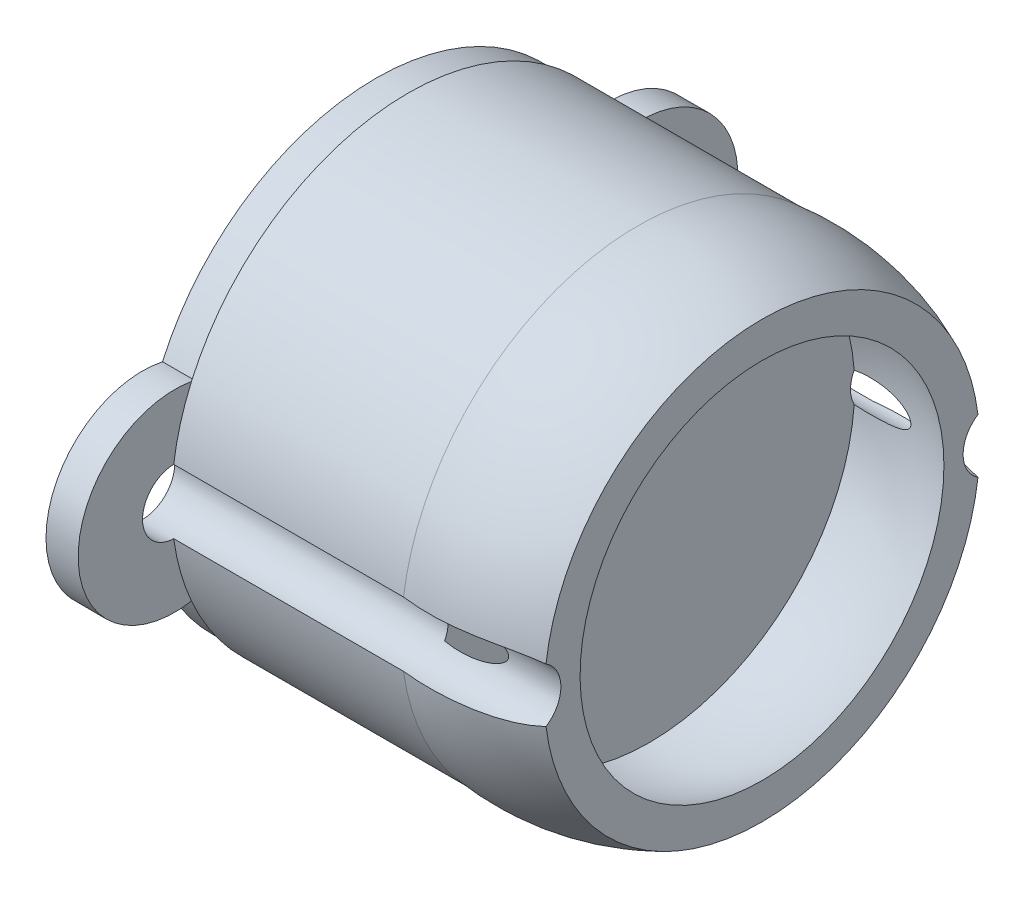
ISO-10303-21;
HEADER;
FILE_DESCRIPTION(('STEP AP214'),'2;1');
FILE_NAME('part.step','',(''),(''),'','','');
FILE_SCHEMA(('AUTOMOTIVE_DESIGN { 1 0 10303 214 1 1 1 1 }'));
ENDSEC;
DATA;
#1=APPLICATION_CONTEXT('core data for automotive mechanical design processes');
#2=APPLICATION_PROTOCOL_DEFINITION('international standard','automotive_design',2000,#1);
#3=PRODUCT_CONTEXT('',#1,'mechanical');
#4=PRODUCT('Part','Part','',(#3));
#5=PRODUCT_RELATED_PRODUCT_CATEGORY('part','',(#4));
#6=PRODUCT_DEFINITION_FORMATION('','',#4);
#7=PRODUCT_DEFINITION_CONTEXT('part definition',#1,'design');
#8=PRODUCT_DEFINITION('design','',#6,#7);
#9=PRODUCT_DEFINITION_SHAPE('','',#8);
#10=(LENGTH_UNIT() NAMED_UNIT(*) SI_UNIT(.MILLI.,.METRE.));
#11=(NAMED_UNIT(*) PLANE_ANGLE_UNIT() SI_UNIT($,.RADIAN.));
#12=(NAMED_UNIT(*) SI_UNIT($,.STERADIAN.) SOLID_ANGLE_UNIT());
#13=UNCERTAINTY_MEASURE_WITH_UNIT(LENGTH_MEASURE(1.E-05),#10,'distance_accuracy_value','');
#14=(GEOMETRIC_REPRESENTATION_CONTEXT(3) GLOBAL_UNCERTAINTY_ASSIGNED_CONTEXT((#13)) GLOBAL_UNIT_ASSIGNED_CONTEXT((#10,
#11,#12)) REPRESENTATION_CONTEXT('',''));
#15=CARTESIAN_POINT('',(0.,0.,0.));
#16=DIRECTION('',(0.,0.,1.));
#17=DIRECTION('',(1.,0.,0.));
#18=AXIS2_PLACEMENT_3D('',#15,#16,#17);
#19=CARTESIAN_POINT('',(0.,0.,0.));
#20=DIRECTION('',(-1.,0.,0.));
#21=DIRECTION('',(0.,1.,0.));
#22=AXIS2_PLACEMENT_3D('',#19,#20,#21);
#23=SPHERICAL_SURFACE('',#22,7.4);
#24=CARTESIAN_POINT('',(3.,0.,0.));
#25=DIRECTION('',(1.,0.,0.));
#26=DIRECTION('',(0.,0.,-1.));
#27=AXIS2_PLACEMENT_3D('',#24,#25,#26);
#28=CIRCLE('',#27,6.76461381011511);
#29=CARTESIAN_POINT('',(3.,0.842878804427795,-6.71189655172414));
#30=VERTEX_POINT('',#29);
#31=CARTESIAN_POINT('',(3.,0.842878804427795,6.71189655172414));
#32=VERTEX_POINT('',#31);
#33=EDGE_CURVE('E163',#30,#32,#28,.T.);
#34=ORIENTED_EDGE('',*,*,#33,.F.);
#35=CARTESIAN_POINT('',(3.0002,0.842825962899222,-6.71181379034483));
#36=CARTESIAN_POINT('',(2.94052392284516,0.85856987616232,-6.73651264605973));
#37=CARTESIAN_POINT('',(2.88021192087948,0.872535783706459,-6.76073072167284));
#38=CARTESIAN_POINT('',(2.75857016443362,0.897435475728505,-6.80803261158258));
#39=CARTESIAN_POINT('',(2.69724111722747,0.908371280811858,-6.83111717326338));
#40=CARTESIAN_POINT('',(2.57390460429067,0.927728292467096,-6.87595257796477));
#41=CARTESIAN_POINT('',(2.51189939879008,0.936156163466943,-6.89770683144518));
#42=CARTESIAN_POINT('',(2.38717399417968,0.950949009020406,-6.93984764776638));
#43=CARTESIAN_POINT('',(2.32445366355035,0.957313597565562,-6.96023395412018));
#44=CARTESIAN_POINT('',(2.13734573728468,0.973691091688867,-7.01859585462346));
#45=CARTESIAN_POINT('',(2.01208494708901,0.98126450266526,-7.05447702100492));
#46=CARTESIAN_POINT('',(1.75969596793601,0.992088194149682,-7.12013224646779));
#47=CARTESIAN_POINT('',(1.63256617814521,0.995334520501119,-7.14990069867588));
#48=CARTESIAN_POINT('',(1.40890128498073,0.998756434348531,-7.19632327820146));
#49=CARTESIAN_POINT('',(1.31266569913933,0.999496924264198,-7.21439531998566));
#50=CARTESIAN_POINT('',(1.11955541337494,1.00012634603968,-7.24678745454948));
#51=CARTESIAN_POINT('',(1.02268067619043,1.00001522780588,-7.26110732656633));
#52=CARTESIAN_POINT('',(0.8284549642304,0.999432205293791,-7.28590290932634));
#53=CARTESIAN_POINT('',(0.731104055197729,0.998960349497552,-7.29637913636393));
#54=CARTESIAN_POINT('',(0.536060782720088,0.998023189220245,-7.31342408006376));
#55=CARTESIAN_POINT('',(0.43836842143589,0.997557884697813,-7.31999282140839));
#56=CARTESIAN_POINT('',(0.240579429502072,0.996863433113591,-7.32928423720738));
#57=CARTESIAN_POINT('',(0.140478503394669,0.996639879179858,-7.33191634054659));
#58=CARTESIAN_POINT('',(-0.0597489378480785,0.996546580765673,-7.33303134087526));
#59=CARTESIAN_POINT('',(-0.159875453516562,0.996676844381574,-7.33151414291688));
#60=CARTESIAN_POINT('',(-0.36003126524138,0.997241477962107,-7.32433747782041));
#61=CARTESIAN_POINT('',(-0.46006048223718,0.997676008181235,-7.31867582776509));
#62=CARTESIAN_POINT('',(-0.659799728251885,0.998603920638728,-7.30325221044215));
#63=CARTESIAN_POINT('',(-0.759509765250003,0.999097301393896,-7.29349034649564));
#64=CARTESIAN_POINT('',(-0.858978201865889,0.999497414605628,-7.28170044473926));
#65=B_SPLINE_CURVE_WITH_KNOTS('',3,(#35,#36,#37,#38,#39,#40,#41,#42,#43,#44,#45,#46,#47,#48,#49,
#50,#51,#52,#53,#54,#55,#56,#57,#58,#59,#60,#61,#62,#63,#64),.UNSPECIFIED.,.F.,.F.,(4,2,2,2,2,2,
2,2,2,2,2,2,2,2,4),(0.,0.199359639390929,0.398586015302419,0.597278152275551,0.796007440072744,
1.18727368016281,1.57889722080513,1.8725842723743,2.16628859944464,2.45995346046835,
2.75361646648065,3.05393716098586,3.35426472774209,3.65475059343574,3.95522888765317),.UNSPECIFIED.);
#66=CARTESIAN_POINT('',(-0.858778201865886,0.999496662862131,-7.28172413793103));
#67=VERTEX_POINT('',#66);
#68=EDGE_CURVE('E141',#30,#67,#65,.T.);
#69=ORIENTED_EDGE('',*,*,#68,.T.);
#70=CARTESIAN_POINT('',(-0.858778201865886,0.,0.));
#71=DIRECTION('',(1.,0.,0.));
#72=DIRECTION('',(0.,0.,-1.));
#73=AXIS2_PLACEMENT_3D('',#70,#71,#72);
#74=CIRCLE('',#73,7.35);
#75=CARTESIAN_POINT('',(-0.858778201865886,0.99949666286213,7.28172413793103));
#76=VERTEX_POINT('',#75);
#77=EDGE_CURVE('E49',#76,#67,#74,.F.);
#78=ORIENTED_EDGE('',*,*,#77,.F.);
#79=CARTESIAN_POINT('',(-0.85897820186589,0.999497414605628,7.28170044473926));
#80=CARTESIAN_POINT('',(-0.774344868476737,0.999166023312695,7.29173021962759));
#81=CARTESIAN_POINT('',(-0.689537675667096,0.998756143069292,7.30029380749209));
#82=CARTESIAN_POINT('',(-0.519674613829083,0.997949143013654,7.31445811244261));
#83=CARTESIAN_POINT('',(-0.434618739933436,0.997552023453025,7.32005877114145));
#84=CARTESIAN_POINT('',(-0.264406065076853,0.996940472518664,7.32826413653552));
#85=CARTESIAN_POINT('',(-0.179249342049621,0.996725943907646,7.33087043810973));
#86=CARTESIAN_POINT('',(-0.00890137042662052,0.99654268835869,7.33308126242885));
#87=CARTESIAN_POINT('',(0.076289877734785,0.99657395841881,7.33268582183408));
#88=CARTESIAN_POINT('',(0.328612284238158,0.997040041085887,7.32706434616021));
#89=CARTESIAN_POINT('',(0.495667100788743,0.997834385811191,7.31755412166948));
#90=CARTESIAN_POINT('',(0.828774125578414,0.999424014195547,7.28713054894258));
#91=CARTESIAN_POINT('',(0.994825982319595,1.00021929807885,7.26621341368135));
#92=CARTESIAN_POINT('',(1.31724352695357,0.999689411087638,7.21462784814186));
#93=CARTESIAN_POINT('',(1.47369208563147,0.998464019990784,7.18447469693398));
#94=CARTESIAN_POINT('',(1.7842635639575,0.991426545173003,7.11468823519463));
#95=CARTESIAN_POINT('',(1.93838832220338,0.985618305021037,7.07506288825923));
#96=CARTESIAN_POINT('',(2.16872532545103,0.970702907982303,7.00863355486231));
#97=CARTESIAN_POINT('',(2.24607868697433,0.964610546030119,6.98507205052215));
#98=CARTESIAN_POINT('',(2.39982176234039,0.949710111793187,6.93581101986002));
#99=CARTESIAN_POINT('',(2.47621173805002,0.940902794802046,6.9101120896146));
#100=CARTESIAN_POINT('',(2.6280768735203,0.919841443121517,6.85665473151799));
#101=CARTESIAN_POINT('',(2.7035484273195,0.907576720608523,6.82889011711303));
#102=CARTESIAN_POINT('',(2.81566675384788,0.885941159615761,6.78592555227531));
#103=CARTESIAN_POINT('',(2.85287711853164,0.878184676420503,6.77137650460669));
#104=CARTESIAN_POINT('',(2.92687320171281,0.861453364498084,6.74188164152994));
#105=CARTESIAN_POINT('',(2.96365882571267,0.852478270109468,6.72693574017946));
#106=CARTESIAN_POINT('',(3.0002,0.842825962899222,6.71181379034483));
#107=B_SPLINE_CURVE_WITH_KNOTS('',3,(#79,#80,#81,#82,#83,#84,#85,#86,#87,#88,#89,#90,#91,#92,
#93,#94,#95,#96,#97,#98,#99,#100,#101,#102,#103,#104,#105,#106),.UNSPECIFIED.,.F.,.F.,(4,2,2,2,
2,2,2,2,2,2,2,2,2,4),(0.,0.255666299548316,0.511337637042939,0.766872733555695,1.0224047092203,
1.52395408463691,2.02567007285728,2.5033453484021,2.98062042991518,3.22383079476211,
3.46697356007113,3.71087635009909,3.83295493443389,3.95506017518141),.UNSPECIFIED.);
#108=EDGE_CURVE('E170',#76,#32,#107,.T.);
#109=ORIENTED_EDGE('',*,*,#108,.T.);
#110=EDGE_LOOP('',(#34,#69,#78,#109));
#111=FACE_BOUND('',#110,.T.);
#112=ADVANCED_FACE('F39',(#111),#23,.T.);
#113=CARTESIAN_POINT('',(-0.5,0.,0.));
#114=DIRECTION('',(-1.,0.,0.));
#115=DIRECTION('',(0.,0.,1.));
#116=AXIS2_PLACEMENT_3D('',#113,#114,#115);
#117=CYLINDRICAL_SURFACE('',#116,7.35);
#118=CARTESIAN_POINT('',(-8.,0.,0.));
#119=DIRECTION('',(-1.,0.,0.));
#120=DIRECTION('',(0.,0.,1.));
#121=AXIS2_PLACEMENT_3D('',#118,#119,#120);
#122=CIRCLE('',#121,7.35);
#123=CARTESIAN_POINT('',(-8.,-0.999496662862128,-7.28172413793104));
#124=VERTEX_POINT('',#123);
#125=CARTESIAN_POINT('',(-8.,-2.9545896500191,-6.73));
#126=VERTEX_POINT('',#125);
#127=EDGE_CURVE('E280',#124,#126,#122,.T.);
#128=ORIENTED_EDGE('',*,*,#127,.F.);
#129=DIRECTION('',(-1.,0.,0.));
#130=VECTOR('',#129,1.);
#131=CARTESIAN_POINT('',(-3.,-0.999496662862128,-7.28172413793104));
#132=LINE('',#131,#130);
#133=CARTESIAN_POINT('',(-0.858778201865886,-0.999496662862126,-7.28172413793103));
#134=VERTEX_POINT('',#133);
#135=EDGE_CURVE('E265',#124,#134,#132,.F.);
#136=ORIENTED_EDGE('',*,*,#135,.T.);
#137=CARTESIAN_POINT('',(-0.858778201865886,-0.999496662862129,7.28172413793103));
#138=VERTEX_POINT('',#137);
#139=EDGE_CURVE('E11',#134,#138,#74,.F.);
#140=ORIENTED_EDGE('',*,*,#139,.T.);
#141=DIRECTION('',(-1.,0.,0.));
#142=VECTOR('',#141,1.);
#143=CARTESIAN_POINT('',(-3.,-0.99949666286213,7.28172413793103));
#144=LINE('',#143,#142);
#145=CARTESIAN_POINT('',(-8.,-0.99949666286213,7.28172413793103));
#146=VERTEX_POINT('',#145);
#147=EDGE_CURVE('E202',#138,#146,#144,.T.);
#148=ORIENTED_EDGE('',*,*,#147,.T.);
#149=CARTESIAN_POINT('',(-8.,0.,0.));
#150=DIRECTION('',(-1.,0.,0.));
#151=DIRECTION('',(0.,0.,1.));
#152=AXIS2_PLACEMENT_3D('',#149,#150,#151);
#153=CIRCLE('',#152,7.35);
#154=CARTESIAN_POINT('',(-8.,-2.9545896500191,6.73));
#155=VERTEX_POINT('',#154);
#156=EDGE_CURVE('E320',#155,#146,#153,.T.);
#157=ORIENTED_EDGE('',*,*,#156,.F.);
#158=CARTESIAN_POINT('',(-8.,0.,0.));
#159=DIRECTION('',(1.,0.,0.));
#160=DIRECTION('',(0.,0.,-1.));
#161=AXIS2_PLACEMENT_3D('',#158,#159,#160);
#162=CIRCLE('',#161,7.35);
#163=EDGE_CURVE('E283',#155,#126,#162,.T.);
#164=ORIENTED_EDGE('',*,*,#163,.T.);
#165=EDGE_LOOP('',(#128,#136,#140,#148,#157,#164));
#166=FACE_BOUND('',#165,.T.);
#167=ADVANCED_FACE('F278',(#166),#117,.T.);
#168=CARTESIAN_POINT('',(-8.,0.,0.));
#169=DIRECTION('',(1.,0.,0.));
#170=DIRECTION('',(0.,0.,-1.));
#171=AXIS2_PLACEMENT_3D('',#168,#169,#170);
#172=PLANE('',#171);
#173=CARTESIAN_POINT('',(-8.,2.9545896500191,-6.73));
#174=VERTEX_POINT('',#173);
#175=CARTESIAN_POINT('',(-8.,2.9545896500191,6.73));
#176=VERTEX_POINT('',#175);
#177=EDGE_CURVE('E328',#174,#176,#162,.T.);
#178=ORIENTED_EDGE('',*,*,#177,.F.);
#179=CARTESIAN_POINT('',(-8.,0.,-7.25));
#180=DIRECTION('',(-1.,0.,0.));
#181=DIRECTION('',(0.,0.,1.));
#182=AXIS2_PLACEMENT_3D('',#179,#180,#181);
#183=CIRCLE('',#182,3.);
#184=CARTESIAN_POINT('',(-8.,2.93508847429885,-6.62931034482759));
#185=VERTEX_POINT('',#184);
#186=EDGE_CURVE('E346',#185,#174,#183,.T.);
#187=ORIENTED_EDGE('',*,*,#186,.F.);
#188=CARTESIAN_POINT('',(-8.,0.,0.));
#189=DIRECTION('',(1.,0.,0.));
#190=DIRECTION('',(0.,0.,-1.));
#191=AXIS2_PLACEMENT_3D('',#188,#189,#190);
#192=CIRCLE('',#191,7.25);
#193=CARTESIAN_POINT('',(-8.,2.93508847429885,6.62931034482759));
#194=VERTEX_POINT('',#193);
#195=EDGE_CURVE('E324',#185,#194,#192,.T.);
#196=ORIENTED_EDGE('',*,*,#195,.T.);
#197=CARTESIAN_POINT('',(-8.,0.,7.25));
#198=DIRECTION('',(-1.,0.,0.));
#199=DIRECTION('',(0.,0.,1.));
#200=AXIS2_PLACEMENT_3D('',#197,#198,#199);
#201=CIRCLE('',#200,3.);
#202=EDGE_CURVE('E304',#176,#194,#201,.T.);
#203=ORIENTED_EDGE('',*,*,#202,.F.);
#204=EDGE_LOOP('',(#178,#187,#196,#203));
#205=FACE_BOUND('',#204,.T.);
#206=ADVANCED_FACE('F344',(#205),#172,.F.);
#207=CARTESIAN_POINT('',(-9.,0.,0.));
#208=DIRECTION('',(1.,0.,0.));
#209=DIRECTION('',(0.,0.,-1.));
#210=AXIS2_PLACEMENT_3D('',#207,#208,#209);
#211=CYLINDRICAL_SURFACE('',#210,7.25);
#212=DIRECTION('',(-1.,0.,0.));
#213=VECTOR('',#212,1.);
#214=CARTESIAN_POINT('',(-8.5,2.93508847429885,-6.62931034482759));
#215=LINE('',#214,#213);
#216=CARTESIAN_POINT('',(-9.,2.93508847429885,-6.62931034482759));
#217=VERTEX_POINT('',#216);
#218=EDGE_CURVE('E288',#217,#185,#215,.F.);
#219=ORIENTED_EDGE('',*,*,#218,.F.);
#220=CARTESIAN_POINT('',(-9.,0.,0.));
#221=DIRECTION('',(1.,0.,0.));
#222=DIRECTION('',(0.,0.,-1.));
#223=AXIS2_PLACEMENT_3D('',#220,#221,#222);
#224=CIRCLE('',#223,7.25);
#225=CARTESIAN_POINT('',(-9.,2.93508847429885,6.62931034482759));
#226=VERTEX_POINT('',#225);
#227=EDGE_CURVE('E329',#217,#226,#224,.T.);
#228=ORIENTED_EDGE('',*,*,#227,.T.);
#229=DIRECTION('',(-1.,0.,0.));
#230=VECTOR('',#229,1.);
#231=CARTESIAN_POINT('',(-8.5,2.93508847429885,6.62931034482759));
#232=LINE('',#231,#230);
#233=EDGE_CURVE('E308',#194,#226,#232,.T.);
#234=ORIENTED_EDGE('',*,*,#233,.F.);
#235=ORIENTED_EDGE('',*,*,#195,.F.);
#236=EDGE_LOOP('',(#219,#228,#234,#235));
#237=FACE_BOUND('',#236,.T.);
#238=ADVANCED_FACE('F354',(#237),#211,.T.);
#239=ORIENTED_EDGE('',*,*,#139,.F.);
#240=CARTESIAN_POINT('',(-0.85897820186589,-0.999497414605626,-7.28170044473926));
#241=CARTESIAN_POINT('',(-0.774344868476737,-0.999166023312693,-7.29173021962759));
#242=CARTESIAN_POINT('',(-0.689537675667096,-0.998756143069291,-7.30029380749209));
#243=CARTESIAN_POINT('',(-0.519674613829083,-0.997949143013653,-7.31445811244261));
#244=CARTESIAN_POINT('',(-0.434618739933436,-0.997552023453023,-7.32005877114145));
#245=CARTESIAN_POINT('',(-0.264406065076853,-0.996940472518662,-7.32826413653552));
#246=CARTESIAN_POINT('',(-0.179249342049621,-0.996725943907644,-7.33087043810973));
#247=CARTESIAN_POINT('',(-0.00890137042662122,-0.996542688358688,-7.33308126242885));
#248=CARTESIAN_POINT('',(0.0762898777347842,-0.996573958418809,-7.33268582183408));
#249=CARTESIAN_POINT('',(0.328612284238157,-0.997040041085885,-7.32706434616021));
#250=CARTESIAN_POINT('',(0.495667100788742,-0.997834385811189,-7.31755412166949));
#251=CARTESIAN_POINT('',(0.828774125578413,-0.999424014195545,-7.28713054894258));
#252=CARTESIAN_POINT('',(0.994825982319593,-1.00021929807885,-7.26621341368135));
#253=CARTESIAN_POINT('',(1.31724352695357,-0.999689411087636,-7.21462784814186));
#254=CARTESIAN_POINT('',(1.47369208563147,-0.998464019990783,-7.18447469693398));
#255=CARTESIAN_POINT('',(1.7842635639575,-0.991426545173001,-7.11468823519463));
#256=CARTESIAN_POINT('',(1.93838832220338,-0.985618305021036,-7.07506288825923));
#257=CARTESIAN_POINT('',(2.16872532545103,-0.970702907982302,-7.00863355486231));
#258=CARTESIAN_POINT('',(2.24607868697433,-0.964610546030117,-6.98507205052215));
#259=CARTESIAN_POINT('',(2.39982176234039,-0.949710111793185,-6.93581101986002));
#260=CARTESIAN_POINT('',(2.47621173805002,-0.940902794802044,-6.9101120896146));
#261=CARTESIAN_POINT('',(2.6280768735203,-0.919841443121516,-6.85665473151799));
#262=CARTESIAN_POINT('',(2.7035484273195,-0.907576720608521,-6.82889011711303));
#263=CARTESIAN_POINT('',(2.81566675384788,-0.885941159615759,-6.78592555227531));
#264=CARTESIAN_POINT('',(2.85287711853164,-0.878184676420501,-6.77137650460669));
#265=CARTESIAN_POINT('',(2.92687320171281,-0.861453364498082,-6.74188164152994));
#266=CARTESIAN_POINT('',(2.96365882571267,-0.852478270109466,-6.72693574017946));
#267=CARTESIAN_POINT('',(3.0002,-0.84282596289922,-6.71181379034483));
#268=B_SPLINE_CURVE_WITH_KNOTS('',3,(#240,#241,#242,#243,#244,#245,#246,#247,#248,#249,#250,
#251,#252,#253,#254,#255,#256,#257,#258,#259,#260,#261,#262,#263,#264,#265,#266,#267),
.UNSPECIFIED.,.F.,.F.,(4,2,2,2,2,2,2,2,2,2,2,2,2,4),(0.,0.255666299548315,0.511337637042939,
0.766872733555694,1.0224047092203,1.52395408463691,2.02567007285728,2.5033453484021,
2.98062042991518,3.22383079476211,3.46697356007113,3.71087635009909,3.83295493443389,
3.95506017518141),.UNSPECIFIED.);
#269=CARTESIAN_POINT('',(3.,-0.842878804427793,-6.71189655172414));
#270=VERTEX_POINT('',#269);
#271=EDGE_CURVE('E155',#134,#270,#268,.T.);
#272=ORIENTED_EDGE('',*,*,#271,.T.);
#273=CARTESIAN_POINT('',(3.,-0.842878804427795,6.71189655172414));
#274=VERTEX_POINT('',#273);
#275=EDGE_CURVE('E165',#274,#270,#28,.T.);
#276=ORIENTED_EDGE('',*,*,#275,.F.);
#277=CARTESIAN_POINT('',(3.0002,-0.842825962899222,6.71181379034483));
#278=CARTESIAN_POINT('',(2.94052392284516,-0.85856987616232,6.73651264605973));
#279=CARTESIAN_POINT('',(2.88021192087948,-0.872535783706459,6.76073072167284));
#280=CARTESIAN_POINT('',(2.75857016443362,-0.897435475728506,6.80803261158258));
#281=CARTESIAN_POINT('',(2.69724111722747,-0.908371280811858,6.83111717326338));
#282=CARTESIAN_POINT('',(2.57390460429067,-0.927728292467097,6.87595257796477));
#283=CARTESIAN_POINT('',(2.51189939879008,-0.936156163466944,6.89770683144518));
#284=CARTESIAN_POINT('',(2.38717399417968,-0.950949009020406,6.93984764776638));
#285=CARTESIAN_POINT('',(2.32445366355035,-0.957313597565562,6.96023395412018));
#286=CARTESIAN_POINT('',(2.13734573728467,-0.973691091688867,7.01859585462346));
#287=CARTESIAN_POINT('',(2.01208494708901,-0.981264502665261,7.05447702100493));
#288=CARTESIAN_POINT('',(1.75969596793601,-0.992088194149683,7.12013224646779));
#289=CARTESIAN_POINT('',(1.63256617814521,-0.995334520501119,7.14990069867588));
#290=CARTESIAN_POINT('',(1.40890128498073,-0.998756434348531,7.19632327820146));
#291=CARTESIAN_POINT('',(1.31266569913933,-0.999496924264198,7.21439531998566));
#292=CARTESIAN_POINT('',(1.11955541337494,-1.00012634603968,7.24678745454948));
#293=CARTESIAN_POINT('',(1.02268067619043,-1.00001522780588,7.26110732656633));
#294=CARTESIAN_POINT('',(0.828454964230399,-0.999432205293791,7.28590290932634));
#295=CARTESIAN_POINT('',(0.731104055197728,-0.998960349497552,7.29637913636393));
#296=CARTESIAN_POINT('',(0.536060782720087,-0.998023189220245,7.31342408006376));
#297=CARTESIAN_POINT('',(0.438368421435889,-0.997557884697813,7.31999282140839));
#298=CARTESIAN_POINT('',(0.24057942950207,-0.996863433113591,7.32928423720738));
#299=CARTESIAN_POINT('',(0.140478503394668,-0.996639879179858,7.33191634054659));
#300=CARTESIAN_POINT('',(-0.0597489378480796,-0.996546580765673,7.33303134087526));
#301=CARTESIAN_POINT('',(-0.159875453516563,-0.996676844381574,7.33151414291688));
#302=CARTESIAN_POINT('',(-0.360031265241381,-0.997241477962107,7.32433747782041));
#303=CARTESIAN_POINT('',(-0.460060482237181,-0.997676008181235,7.31867582776509));
#304=CARTESIAN_POINT('',(-0.659799728251886,-0.998603920638728,7.30325221044215));
#305=CARTESIAN_POINT('',(-0.759509765250003,-0.999097301393896,7.29349034649564));
#306=CARTESIAN_POINT('',(-0.85897820186589,-0.999497414605628,7.28170044473926));
#307=B_SPLINE_CURVE_WITH_KNOTS('',3,(#277,#278,#279,#280,#281,#282,#283,#284,#285,#286,#287,
#288,#289,#290,#291,#292,#293,#294,#295,#296,#297,#298,#299,#300,#301,#302,#303,#304,#305,#306),
.UNSPECIFIED.,.F.,.F.,(4,2,2,2,2,2,2,2,2,2,2,2,2,2,4),(0.,0.199359639390929,0.39858601530242,
0.597278152275552,0.796007440072745,1.18727368016281,1.57889722080513,1.8725842723743,
2.16628859944464,2.45995346046835,2.75361646648065,3.05393716098586,3.3542647277421,
3.65475059343575,3.95522888765317),.UNSPECIFIED.);
#308=EDGE_CURVE('E206',#274,#138,#307,.T.);
#309=ORIENTED_EDGE('',*,*,#308,.T.);
#310=EDGE_LOOP('',(#239,#272,#276,#309));
#311=FACE_BOUND('',#310,.T.);
#312=ADVANCED_FACE('F41',(#311),#23,.T.);
#313=CARTESIAN_POINT('',(3.,0.,0.));
#314=DIRECTION('',(1.,0.,0.));
#315=DIRECTION('',(0.,0.,-1.));
#316=AXIS2_PLACEMENT_3D('',#313,#314,#315);
#317=PLANE('',#316);
#318=CARTESIAN_POINT('',(3.,0.,-7.25));
#319=DIRECTION('',(-1.,0.,0.));
#320=DIRECTION('',(0.,0.,1.));
#321=AXIS2_PLACEMENT_3D('',#318,#319,#320);
#322=CIRCLE('',#321,1.);
#323=EDGE_CURVE('E146',#270,#30,#322,.T.);
#324=ORIENTED_EDGE('',*,*,#323,.T.);
#325=ORIENTED_EDGE('',*,*,#33,.T.);
#326=CARTESIAN_POINT('',(3.,0.,7.25));
#327=DIRECTION('',(-1.,0.,0.));
#328=DIRECTION('',(0.,0.,1.));
#329=AXIS2_PLACEMENT_3D('',#326,#327,#328);
#330=CIRCLE('',#329,1.);
#331=EDGE_CURVE('E167',#32,#274,#330,.T.);
#332=ORIENTED_EDGE('',*,*,#331,.T.);
#333=ORIENTED_EDGE('',*,*,#275,.T.);
#334=EDGE_LOOP('',(#324,#325,#332,#333));
#335=FACE_BOUND('',#334,.T.);
#336=CARTESIAN_POINT('',(3.,0.,0.));
#337=DIRECTION('',(1.,0.,0.));
#338=DIRECTION('',(0.,0.,-1.));
#339=AXIS2_PLACEMENT_3D('',#336,#337,#338);
#340=CIRCLE('',#339,5.65331761004103);
#341=CARTESIAN_POINT('',(3.,0.,-5.65331761004103));
#342=VERTEX_POINT('',#341);
#343=EDGE_CURVE('E178',#342,#342,#340,.T.);
#344=ORIENTED_EDGE('',*,*,#343,.F.);
#345=EDGE_LOOP('',(#344));
#346=FACE_BOUND('',#345,.T.);
#347=ADVANCED_FACE('F160',(#335,#346),#317,.T.);
#348=CARTESIAN_POINT('',(0.,0.,0.));
#349=DIRECTION('',(-1.,0.,0.));
#350=DIRECTION('',(0.,1.,0.));
#351=AXIS2_PLACEMENT_3D('',#348,#349,#350);
#352=SPHERICAL_SURFACE('',#351,6.4);
#353=CARTESIAN_POINT('',(-0.5002,-0.462933322703052,-6.3636068937931));
#354=CARTESIAN_POINT('',(-0.458650095410539,-0.46841437063849,-6.36647409257642));
#355=CARTESIAN_POINT('',(-0.416981635171948,-0.473119647532667,-6.3689911220935));
#356=CARTESIAN_POINT('',(-0.333474165671028,-0.481084098735694,-6.37331288116804));
#357=CARTESIAN_POINT('',(-0.291635176562639,-0.484343439201789,-6.37511769256615));
#358=CARTESIAN_POINT('',(-0.165853550103934,-0.492118112247256,-6.37944997970792));
#359=CARTESIAN_POINT('',(-0.0817400508455604,-0.494618233467956,-6.38088880061276));
#360=CARTESIAN_POINT('',(0.087495704397338,-0.494519350356548,-6.38083423514174));
#361=CARTESIAN_POINT('',(0.172617763214464,-0.491857841076482,-6.37930490567506));
#362=CARTESIAN_POINT('',(0.34237215300485,-0.481034325561377,-6.37327390131291));
#363=CARTESIAN_POINT('',(0.427004796652089,-0.472876344156224,-6.36877440139415));
#364=CARTESIAN_POINT('',(0.557691864158815,-0.455157898885523,-6.35956249493866));
#365=CARTESIAN_POINT('',(0.604125875416311,-0.447843698795485,-6.35583909513926));
#366=CARTESIAN_POINT('',(0.696522221986498,-0.430901471453666,-6.34755106100987));
#367=CARTESIAN_POINT('',(0.742484350183784,-0.421272469977339,-6.34298607267175));
#368=CARTESIAN_POINT('',(0.833781381738858,-0.399214212828903,-6.3330617322694));
#369=CARTESIAN_POINT('',(0.879114484043501,-0.386778191616233,-6.32770047187068));
#370=CARTESIAN_POINT('',(0.968529048899107,-0.358400519370426,-6.31630688581247));
#371=CARTESIAN_POINT('',(1.01261205285642,-0.342463418247465,-6.31027543609495));
#372=CARTESIAN_POINT('',(1.09936984501094,-0.305621711028475,-6.29763947045228));
#373=CARTESIAN_POINT('',(1.14202018255555,-0.284657574147367,-6.29102874034807));
#374=CARTESIAN_POINT('',(1.20260694091954,-0.247951008796482,-6.2811480466345));
#375=CARTESIAN_POINT('',(1.22216201889347,-0.234904927705541,-6.27787416578056));
#376=CARTESIAN_POINT('',(1.25959957559066,-0.206598724147042,-6.27146581401044));
#377=CARTESIAN_POINT('',(1.27748667789418,-0.191345040401631,-6.26833097116868));
#378=CARTESIAN_POINT('',(1.30525776558681,-0.163403942531514,-6.26337447236876));
#379=CARTESIAN_POINT('',(1.31586802642429,-0.151463721763344,-6.26145422443096));
#380=CARTESIAN_POINT('',(1.33527942313019,-0.126136854650797,-6.25790498958649));
#381=CARTESIAN_POINT('',(1.34408331556059,-0.112752460506467,-6.25627555938696));
#382=CARTESIAN_POINT('',(1.3570894806245,-0.0882897614765934,-6.25385096264133));
#383=CARTESIAN_POINT('',(1.36189285029071,-0.0775453904988696,-6.25294917615061));
#384=CARTESIAN_POINT('',(1.36972103745324,-0.0554019430210201,-6.25147446412438));
#385=CARTESIAN_POINT('',(1.37274785007956,-0.0440036167927828,-6.25090116969912));
#386=CARTESIAN_POINT('',(1.37672570878526,-0.0207369353463676,-6.25014693905982));
#387=CARTESIAN_POINT('',(1.37766067497041,-0.00886564824215806,-6.24996904231146));
#388=CARTESIAN_POINT('',(1.37728783055615,0.014839749268906,-6.25003988017756));
#389=CARTESIAN_POINT('',(1.3759800979252,0.0266738609538517,-6.2502885999605));
#390=CARTESIAN_POINT('',(1.37153385523734,0.0486758617958691,-6.25113095957924));
#391=CARTESIAN_POINT('',(1.3686012610685,0.0588885171700064,-6.25168577903586));
#392=CARTESIAN_POINT('',(1.3613163523726,0.0787700919412726,-6.25305731834014));
#393=CARTESIAN_POINT('',(1.35696329230116,0.0884387226709555,-6.25387417571695));
#394=CARTESIAN_POINT('',(1.34402857563154,0.112989120339667,-6.25628622460112));
#395=CARTESIAN_POINT('',(1.33450391835775,0.127355362745212,-6.25804889851127));
#396=CARTESIAN_POINT('',(1.31340256170474,0.154438245194384,-6.26190252499605));
#397=CARTESIAN_POINT('',(1.30181978067636,0.167149797349709,-6.26399444833342));
#398=CARTESIAN_POINT('',(1.26703097088228,0.201149013668378,-6.2701815752664));
#399=CARTESIAN_POINT('',(1.24220446831071,0.220719959319908,-6.27448921373171));
#400=CARTESIAN_POINT('',(1.19015339875719,0.256265990202195,-6.28322234735263));
#401=CARTESIAN_POINT('',(1.16292189123113,0.272230161580118,-6.28764815607307));
#402=CARTESIAN_POINT('',(1.09566597304808,0.307400759819597,-6.29817619718633));
#403=CARTESIAN_POINT('',(1.05494709608595,0.325280907093708,-6.30422732105287));
#404=CARTESIAN_POINT('',(0.971947262919731,0.35722938577639,-6.31583127551583));
#405=CARTESIAN_POINT('',(0.929663413548839,0.37129021077227,-6.32138311070727));
#406=CARTESIAN_POINT('',(0.843804861782858,0.396554707753387,-6.33188621269283));
#407=CARTESIAN_POINT('',(0.800222407715196,0.407733954691408,-6.33683217010951));
#408=CARTESIAN_POINT('',(0.712472770407752,0.427642310288864,-6.3459869089681));
#409=CARTESIAN_POINT('',(0.668306034424629,0.436373191000046,-6.35019622273604));
#410=CARTESIAN_POINT('',(0.529614661857508,0.460470609298353,-6.36212997706669));
#411=CARTESIAN_POINT('',(0.434338856609097,0.472251458590234,-6.36848116479583));
#412=CARTESIAN_POINT('',(0.242922732672095,0.488560380016579,-6.37742631154018));
#413=CARTESIAN_POINT('',(0.146781392225635,0.493078297349876,-6.38001500947771));
#414=CARTESIAN_POINT('',(-0.0416192386481809,0.495391713398849,-6.38132835536405));
#415=CARTESIAN_POINT('',(-0.13387350006888,0.493459267893599,-6.38020939534759));
#416=CARTESIAN_POINT('',(-0.271772959182147,0.485777868338833,-6.3759137268197));
#417=CARTESIAN_POINT('',(-0.317604286322643,0.482427172681581,-6.37404944136753));
#418=CARTESIAN_POINT('',(-0.409070600848325,0.474004469949052,-6.36946585548982));
#419=CARTESIAN_POINT('',(-0.454705562631815,0.468932244922427,-6.36674644680603));
#420=CARTESIAN_POINT('',(-0.500199999999976,0.462933322703191,-6.36360689379311));
#421=B_SPLINE_CURVE_WITH_KNOTS('',3,(#353,#354,#355,#356,#357,#358,#359,#360,#361,#362,#363,
#364,#365,#366,#367,#368,#369,#370,#371,#372,#373,#374,#375,#376,#377,#378,#379,#380,#381,#382,
#383,#384,#385,#386,#387,#388,#389,#390,#391,#392,#393,#394,#395,#396,#397,#398,#399,#400,#401,
#402,#403,#404,#405,#406,#407,#408,#409,#410,#411,#412,#413,#414,#415,#416,#417,#418,#419,#420),
.UNSPECIFIED.,.F.,.F.,(4,2,2,2,2,2,2,2,2,2,2,2,2,2,2,2,2,2,2,2,2,2,2,2,2,2,2,2,2,2,2,2,2,4),(0.,
0.126001231444508,0.251987979925746,0.504245077314171,0.759575971409507,1.01472010059457,
1.1561286489625,1.29759681609908,1.43940966446935,1.58103929555216,1.7244370388307,
1.795536528448,1.86643267812011,1.91457890521159,1.96265110438974,1.9979328295081,
2.03317485593833,2.06868686821674,2.10419764592885,2.13599216614388,2.16780340091413,
2.21948241892772,2.27131676530623,2.36649400781642,2.46195550379719,2.59628380836151,
2.73087423938981,2.86657053230002,3.00216835744398,3.2903218802876,3.5788779409412,
3.85541998962215,3.99335958568933,4.13131665188668),.UNSPECIFIED.);
#422=CARTESIAN_POINT('',(-0.5,-0.462959737118282,-6.36362068965517));
#423=VERTEX_POINT('',#422);
#424=CARTESIAN_POINT('',(-0.5,0.462959737118284,-6.36362068965517));
#425=VERTEX_POINT('',#424);
#426=EDGE_CURVE('E62',#423,#425,#421,.T.);
#427=ORIENTED_EDGE('',*,*,#426,.F.);
#428=CARTESIAN_POINT('',(-0.5,0.,0.));
#429=DIRECTION('',(1.,0.,0.));
#430=DIRECTION('',(0.,0.,-1.));
#431=AXIS2_PLACEMENT_3D('',#428,#429,#430);
#432=CIRCLE('',#431,6.38043885637971);
#433=CARTESIAN_POINT('',(-0.5,-0.462959737118283,6.36362068965517));
#434=VERTEX_POINT('',#433);
#435=EDGE_CURVE('E172',#434,#423,#432,.T.);
#436=ORIENTED_EDGE('',*,*,#435,.F.);
#437=CARTESIAN_POINT('',(-0.5002,0.462933322703054,6.3636068937931));
#438=CARTESIAN_POINT('',(-0.458650095410539,0.468414370638492,6.36647409257642));
#439=CARTESIAN_POINT('',(-0.416981635171948,0.47311964753267,6.3689911220935));
#440=CARTESIAN_POINT('',(-0.333474165671028,0.481084098735697,6.37331288116804));
#441=CARTESIAN_POINT('',(-0.291635176562639,0.484343439201792,6.37511769256615));
#442=CARTESIAN_POINT('',(-0.165853550103934,0.492118112247259,6.37944997970792));
#443=CARTESIAN_POINT('',(-0.0817400508455592,0.494618233467959,6.38088880061276));
#444=CARTESIAN_POINT('',(0.0874957043973392,0.49451935035655,6.38083423514174));
#445=CARTESIAN_POINT('',(0.172617763214465,0.491857841076483,6.37930490567506));
#446=CARTESIAN_POINT('',(0.342372153004851,0.481034325561379,6.37327390131291));
#447=CARTESIAN_POINT('',(0.427004796652089,0.472876344156226,6.36877440139415));
#448=CARTESIAN_POINT('',(0.557691864158816,0.455157898885526,6.35956249493866));
#449=CARTESIAN_POINT('',(0.604125875416312,0.447843698795487,6.35583909513926));
#450=CARTESIAN_POINT('',(0.6965222219865,0.430901471453669,6.34755106100987));
#451=CARTESIAN_POINT('',(0.742484350183786,0.421272469977343,6.34298607267175));
#452=CARTESIAN_POINT('',(0.833781381738859,0.399214212828906,6.3330617322694));
#453=CARTESIAN_POINT('',(0.879114484043502,0.386778191616234,6.32770047187067));
#454=CARTESIAN_POINT('',(0.968529048899109,0.358400519370426,6.31630688581247));
#455=CARTESIAN_POINT('',(1.01261205285642,0.342463418247466,6.31027543609495));
#456=CARTESIAN_POINT('',(1.09936984501095,0.305621711028476,6.29763947045228));
#457=CARTESIAN_POINT('',(1.14202018255555,0.284657574147368,6.29102874034807));
#458=CARTESIAN_POINT('',(1.20260694091954,0.247951008796483,6.2811480466345));
#459=CARTESIAN_POINT('',(1.22216201889348,0.234904927705542,6.27787416578056));
#460=CARTESIAN_POINT('',(1.25959957559066,0.206598724147042,6.27146581401044));
#461=CARTESIAN_POINT('',(1.27748667789418,0.191345040401631,6.26833097116868));
#462=CARTESIAN_POINT('',(1.30525776558681,0.163403942531513,6.26337447236876));
#463=CARTESIAN_POINT('',(1.31586802642429,0.151463721763343,6.26145422443096));
#464=CARTESIAN_POINT('',(1.3352794231302,0.126136854650795,6.25790498958649));
#465=CARTESIAN_POINT('',(1.34408331556059,0.112752460506465,6.25627555938696));
#466=CARTESIAN_POINT('',(1.3570894806245,0.0882897614765907,6.25385096264133));
#467=CARTESIAN_POINT('',(1.36189285029071,0.0775453904988665,6.25294917615061));
#468=CARTESIAN_POINT('',(1.36972103745325,0.0554019430210182,6.25147446412438));
#469=CARTESIAN_POINT('',(1.37274785007957,0.0440036167927824,6.25090116969912));
#470=CARTESIAN_POINT('',(1.37672570878527,0.0207369353463685,6.25014693905982));
#471=CARTESIAN_POINT('',(1.37766067497041,0.00886564824215857,6.24996904231146));
#472=CARTESIAN_POINT('',(1.37728783055616,-0.0148397492689057,6.25003988017756));
#473=CARTESIAN_POINT('',(1.37598009792521,-0.0266738609538511,6.2502885999605));
#474=CARTESIAN_POINT('',(1.37153385523735,-0.0486758617958683,6.25113095957924));
#475=CARTESIAN_POINT('',(1.36860126106851,-0.0588885171700055,6.25168577903586));
#476=CARTESIAN_POINT('',(1.36131635237261,-0.0787700919412715,6.25305731834014));
#477=CARTESIAN_POINT('',(1.35696329230117,-0.0884387226709542,6.25387417571695));
#478=CARTESIAN_POINT('',(1.34402857563154,-0.112989120339666,6.25628622460112));
#479=CARTESIAN_POINT('',(1.33450391835775,-0.127355362745211,6.25804889851127));
#480=CARTESIAN_POINT('',(1.31340256170475,-0.154438245194384,6.26190252499605));
#481=CARTESIAN_POINT('',(1.30181978067637,-0.16714979734971,6.26399444833342));
#482=CARTESIAN_POINT('',(1.26703097088229,-0.201149013668379,6.2701815752664));
#483=CARTESIAN_POINT('',(1.24220446831072,-0.220719959319909,6.27448921373171));
#484=CARTESIAN_POINT('',(1.1901533987572,-0.256265990202194,6.28322234735263));
#485=CARTESIAN_POINT('',(1.16292189123113,-0.272230161580116,6.28764815607307));
#486=CARTESIAN_POINT('',(1.09566597304808,-0.307400759819595,6.29817619718632));
#487=CARTESIAN_POINT('',(1.05494709608595,-0.325280907093708,6.30422732105287));
#488=CARTESIAN_POINT('',(0.971947262919735,-0.35722938577639,6.31583127551583));
#489=CARTESIAN_POINT('',(0.929663413548843,-0.371290210772271,6.32138311070727));
#490=CARTESIAN_POINT('',(0.843804861782862,-0.396554707753388,6.33188621269283));
#491=CARTESIAN_POINT('',(0.8002224077152,-0.407733954691407,6.33683217010951));
#492=CARTESIAN_POINT('',(0.712472770407758,-0.427642310288862,6.3459869089681));
#493=CARTESIAN_POINT('',(0.668306034424635,-0.436373191000045,6.35019622273604));
#494=CARTESIAN_POINT('',(0.529614661857516,-0.460470609298353,6.36212997706669));
#495=CARTESIAN_POINT('',(0.434338856609106,-0.472251458590233,6.36848116479583));
#496=CARTESIAN_POINT('',(0.242922732672105,-0.488560380016578,6.37742631154018));
#497=CARTESIAN_POINT('',(0.146781392225646,-0.493078297349875,6.3800150094777));
#498=CARTESIAN_POINT('',(-0.0416192386481715,-0.495391713398849,6.38132835536405));
#499=CARTESIAN_POINT('',(-0.133873500068873,-0.493459267893599,6.38020939534759));
#500=CARTESIAN_POINT('',(-0.271772959182142,-0.485777868338834,6.3759137268197));
#501=CARTESIAN_POINT('',(-0.31760428632264,-0.482427172681582,6.37404944136753));
#502=CARTESIAN_POINT('',(-0.409070600848324,-0.474004469949053,6.36946585548982));
#503=CARTESIAN_POINT('',(-0.454705562631814,-0.468932244922428,6.36674644680603));
#504=CARTESIAN_POINT('',(-0.500199999999977,-0.462933322703192,6.36360689379311));
#505=B_SPLINE_CURVE_WITH_KNOTS('',3,(#437,#438,#439,#440,#441,#442,#443,#444,#445,#446,#447,
#448,#449,#450,#451,#452,#453,#454,#455,#456,#457,#458,#459,#460,#461,#462,#463,#464,#465,#466,
#467,#468,#469,#470,#471,#472,#473,#474,#475,#476,#477,#478,#479,#480,#481,#482,#483,#484,#485,
#486,#487,#488,#489,#490,#491,#492,#493,#494,#495,#496,#497,#498,#499,#500,#501,#502,#503,#504),
.UNSPECIFIED.,.F.,.F.,(4,2,2,2,2,2,2,2,2,2,2,2,2,2,2,2,2,2,2,2,2,2,2,2,2,2,2,2,2,2,2,2,2,4),(0.,
0.126001231444508,0.251987979925746,0.504245077314173,0.759575971409508,1.01472010059457,
1.1561286489625,1.29759681609908,1.43940966446936,1.58103929555216,1.7244370388307,
1.79553652844801,1.86643267812012,1.9145789052116,1.96265110438975,1.9979328295081,
2.03317485593834,2.06868686821674,2.10419764592885,2.13599216614388,2.16780340091414,
2.21948241892772,2.27131676530623,2.36649400781643,2.4619555037972,2.59628380836152,
2.73087423938982,2.86657053230002,3.00216835744398,3.2903218802876,3.57887794094119,
3.85541998962216,3.99335958568933,4.13131665188669),.UNSPECIFIED.);
#506=CARTESIAN_POINT('',(-0.5,0.462959737118283,6.36362068965517));
#507=VERTEX_POINT('',#506);
#508=EDGE_CURVE('E55',#507,#434,#505,.T.);
#509=ORIENTED_EDGE('',*,*,#508,.F.);
#510=EDGE_CURVE('E177',#425,#507,#432,.T.);
#511=ORIENTED_EDGE('',*,*,#510,.F.);
#512=EDGE_LOOP('',(#427,#436,#509,#511));
#513=FACE_BOUND('',#512,.T.);
#514=ORIENTED_EDGE('',*,*,#343,.T.);
#515=EDGE_LOOP('',(#514));
#516=FACE_BOUND('',#515,.T.);
#517=ADVANCED_FACE('F239',(#513,#516),#352,.F.);
#518=CARTESIAN_POINT('',(-0.5,0.,0.));
#519=DIRECTION('',(1.,0.,0.));
#520=DIRECTION('',(0.,0.,-1.));
#521=AXIS2_PLACEMENT_3D('',#518,#519,#520);
#522=PLANE('',#521);
#523=CARTESIAN_POINT('',(-0.5,0.,-7.25));
#524=DIRECTION('',(1.,0.,0.));
#525=DIRECTION('',(0.,0.,-1.));
#526=AXIS2_PLACEMENT_3D('',#523,#524,#525);
#527=CIRCLE('',#526,1.);
#528=EDGE_CURVE('E154',#425,#423,#527,.T.);
#529=ORIENTED_EDGE('',*,*,#528,.F.);
#530=ORIENTED_EDGE('',*,*,#510,.T.);
#531=CARTESIAN_POINT('',(-0.5,0.,7.25));
#532=DIRECTION('',(1.,0.,0.));
#533=DIRECTION('',(0.,0.,-1.));
#534=AXIS2_PLACEMENT_3D('',#531,#532,#533);
#535=CIRCLE('',#534,1.);
#536=EDGE_CURVE('E236',#434,#507,#535,.T.);
#537=ORIENTED_EDGE('',*,*,#536,.F.);
#538=ORIENTED_EDGE('',*,*,#435,.T.);
#539=EDGE_LOOP('',(#529,#530,#537,#538));
#540=FACE_BOUND('',#539,.T.);
#541=ADVANCED_FACE('F243',(#540),#522,.T.);
#542=ORIENTED_EDGE('',*,*,#77,.T.);
#543=DIRECTION('',(-1.,0.,0.));
#544=VECTOR('',#543,1.);
#545=CARTESIAN_POINT('',(-3.,0.99949666286213,-7.28172413793104));
#546=LINE('',#545,#544);
#547=CARTESIAN_POINT('',(-8.,0.99949666286213,-7.28172413793104));
#548=VERTEX_POINT('',#547);
#549=EDGE_CURVE('E148',#67,#548,#546,.T.);
#550=ORIENTED_EDGE('',*,*,#549,.T.);
#551=EDGE_CURVE('E287',#174,#548,#122,.T.);
#552=ORIENTED_EDGE('',*,*,#551,.F.);
#553=ORIENTED_EDGE('',*,*,#177,.T.);
#554=CARTESIAN_POINT('',(-8.,0.99949666286213,7.28172413793103));
#555=VERTEX_POINT('',#554);
#556=EDGE_CURVE('E181',#176,#555,#162,.T.);
#557=ORIENTED_EDGE('',*,*,#556,.T.);
#558=DIRECTION('',(-1.,0.,0.));
#559=VECTOR('',#558,1.);
#560=CARTESIAN_POINT('',(-3.,0.99949666286213,7.28172413793103));
#561=LINE('',#560,#559);
#562=EDGE_CURVE('E196',#555,#76,#561,.F.);
#563=ORIENTED_EDGE('',*,*,#562,.T.);
#564=EDGE_LOOP('',(#542,#550,#552,#553,#557,#563));
#565=FACE_BOUND('',#564,.T.);
#566=ADVANCED_FACE('F192',(#565),#117,.T.);
#567=CARTESIAN_POINT('',(-8.,-2.93508847429885,6.62931034482759));
#568=VERTEX_POINT('',#567);
#569=CARTESIAN_POINT('',(-8.,-2.93508847429885,-6.62931034482759));
#570=VERTEX_POINT('',#569);
#571=EDGE_CURVE('E330',#568,#570,#192,.T.);
#572=ORIENTED_EDGE('',*,*,#571,.T.);
#573=EDGE_CURVE('E371',#126,#570,#183,.T.);
#574=ORIENTED_EDGE('',*,*,#573,.F.);
#575=ORIENTED_EDGE('',*,*,#163,.F.);
#576=EDGE_CURVE('E309',#568,#155,#201,.T.);
#577=ORIENTED_EDGE('',*,*,#576,.F.);
#578=EDGE_LOOP('',(#572,#574,#575,#577));
#579=FACE_BOUND('',#578,.T.);
#580=ADVANCED_FACE('F414',(#579),#172,.F.);
#581=DIRECTION('',(-1.,0.,0.));
#582=VECTOR('',#581,1.);
#583=CARTESIAN_POINT('',(-8.5,-2.93508847429885,-6.62931034482759));
#584=LINE('',#583,#582);
#585=CARTESIAN_POINT('',(-9.,-2.93508847429885,-6.62931034482759));
#586=VERTEX_POINT('',#585);
#587=EDGE_CURVE('E293',#570,#586,#584,.T.);
#588=ORIENTED_EDGE('',*,*,#587,.F.);
#589=ORIENTED_EDGE('',*,*,#571,.F.);
#590=DIRECTION('',(-1.,0.,0.));
#591=VECTOR('',#590,1.);
#592=CARTESIAN_POINT('',(-8.5,-2.93508847429885,6.62931034482759));
#593=LINE('',#592,#591);
#594=CARTESIAN_POINT('',(-9.,-2.93508847429885,6.62931034482759));
#595=VERTEX_POINT('',#594);
#596=EDGE_CURVE('E317',#595,#568,#593,.F.);
#597=ORIENTED_EDGE('',*,*,#596,.F.);
#598=EDGE_CURVE('E325',#595,#586,#224,.T.);
#599=ORIENTED_EDGE('',*,*,#598,.T.);
#600=EDGE_LOOP('',(#588,#589,#597,#599));
#601=FACE_BOUND('',#600,.T.);
#602=ADVANCED_FACE('F365',(#601),#211,.T.);
#603=CARTESIAN_POINT('',(-9.,0.,0.));
#604=DIRECTION('',(1.,0.,0.));
#605=DIRECTION('',(0.,0.,-1.));
#606=AXIS2_PLACEMENT_3D('',#603,#604,#605);
#607=PLANE('',#606);
#608=CARTESIAN_POINT('',(-9.,0.,-7.25));
#609=DIRECTION('',(-1.,0.,0.));
#610=DIRECTION('',(0.,0.,1.));
#611=AXIS2_PLACEMENT_3D('',#608,#609,#610);
#612=CIRCLE('',#611,1.);
#613=CARTESIAN_POINT('',(-9.,0.,-6.25));
#614=VERTEX_POINT('',#613);
#615=EDGE_CURVE('E235',#614,#614,#612,.T.);
#616=ORIENTED_EDGE('',*,*,#615,.F.);
#617=EDGE_LOOP('',(#616));
#618=FACE_BOUND('',#617,.T.);
#619=ORIENTED_EDGE('',*,*,#227,.F.);
#620=CARTESIAN_POINT('',(-9.,0.,-7.25));
#621=DIRECTION('',(-1.,0.,0.));
#622=DIRECTION('',(0.,0.,1.));
#623=AXIS2_PLACEMENT_3D('',#620,#621,#622);
#624=CIRCLE('',#623,3.);
#625=EDGE_CURVE('E361',#217,#586,#624,.T.);
#626=ORIENTED_EDGE('',*,*,#625,.T.);
#627=ORIENTED_EDGE('',*,*,#598,.F.);
#628=CARTESIAN_POINT('',(-9.,0.,7.25));
#629=DIRECTION('',(-1.,0.,0.));
#630=DIRECTION('',(0.,0.,1.));
#631=AXIS2_PLACEMENT_3D('',#628,#629,#630);
#632=CIRCLE('',#631,3.);
#633=EDGE_CURVE('E300',#595,#226,#632,.T.);
#634=ORIENTED_EDGE('',*,*,#633,.T.);
#635=EDGE_LOOP('',(#619,#626,#627,#634));
#636=FACE_BOUND('',#635,.T.);
#637=CARTESIAN_POINT('',(-9.,0.,7.25));
#638=DIRECTION('',(-1.,0.,0.));
#639=DIRECTION('',(0.,0.,1.));
#640=AXIS2_PLACEMENT_3D('',#637,#638,#639);
#641=CIRCLE('',#640,1.);
#642=CARTESIAN_POINT('',(-9.,0.,8.25));
#643=VERTEX_POINT('',#642);
#644=EDGE_CURVE('E292',#643,#643,#641,.T.);
#645=ORIENTED_EDGE('',*,*,#644,.F.);
#646=EDGE_LOOP('',(#645));
#647=FACE_BOUND('',#646,.T.);
#648=ADVANCED_FACE('F358',(#618,#636,#647),#607,.F.);
#649=CARTESIAN_POINT('',(-8.,0.,7.25));
#650=DIRECTION('',(-1.,0.,0.));
#651=DIRECTION('',(0.,0.,1.));
#652=AXIS2_PLACEMENT_3D('',#649,#650,#651);
#653=PLANE('',#652);
#654=CARTESIAN_POINT('',(-8.,0.,7.25));
#655=DIRECTION('',(-1.,0.,0.));
#656=DIRECTION('',(0.,0.,1.));
#657=AXIS2_PLACEMENT_3D('',#654,#655,#656);
#658=CIRCLE('',#657,1.);
#659=EDGE_CURVE('E297',#146,#555,#658,.T.);
#660=ORIENTED_EDGE('',*,*,#659,.T.);
#661=ORIENTED_EDGE('',*,*,#556,.F.);
#662=EDGE_CURVE('E310',#155,#176,#201,.T.);
#663=ORIENTED_EDGE('',*,*,#662,.F.);
#664=ORIENTED_EDGE('',*,*,#156,.T.);
#665=EDGE_LOOP('',(#660,#661,#663,#664));
#666=FACE_BOUND('',#665,.T.);
#667=ADVANCED_FACE('F381',(#666),#653,.F.);
#668=CARTESIAN_POINT('',(-8.,0.,7.25));
#669=DIRECTION('',(-1.,0.,0.));
#670=DIRECTION('',(0.,0.,1.));
#671=AXIS2_PLACEMENT_3D('',#668,#669,#670);
#672=CYLINDRICAL_SURFACE('',#671,3.);
#673=ORIENTED_EDGE('',*,*,#633,.F.);
#674=ORIENTED_EDGE('',*,*,#596,.T.);
#675=ORIENTED_EDGE('',*,*,#576,.T.);
#676=ORIENTED_EDGE('',*,*,#662,.T.);
#677=ORIENTED_EDGE('',*,*,#202,.T.);
#678=ORIENTED_EDGE('',*,*,#233,.T.);
#679=EDGE_LOOP('',(#673,#674,#675,#676,#677,#678));
#680=FACE_BOUND('',#679,.T.);
#681=ADVANCED_FACE('F352',(#680),#672,.T.);
#682=CARTESIAN_POINT('',(-8.,0.,7.25));
#683=DIRECTION('',(-1.,0.,0.));
#684=DIRECTION('',(0.,0.,1.));
#685=AXIS2_PLACEMENT_3D('',#682,#683,#684);
#686=CYLINDRICAL_SURFACE('',#685,1.);
#687=ORIENTED_EDGE('',*,*,#659,.F.);
#688=ORIENTED_EDGE('',*,*,#147,.F.);
#689=ORIENTED_EDGE('',*,*,#308,.F.);
#690=ORIENTED_EDGE('',*,*,#331,.F.);
#691=ORIENTED_EDGE('',*,*,#108,.F.);
#692=ORIENTED_EDGE('',*,*,#562,.F.);
#693=EDGE_LOOP('',(#687,#688,#689,#690,#691,#692));
#694=FACE_BOUND('',#693,.T.);
#695=ORIENTED_EDGE('',*,*,#644,.T.);
#696=EDGE_LOOP('',(#695));
#697=FACE_BOUND('',#696,.T.);
#698=ORIENTED_EDGE('',*,*,#508,.T.);
#699=ORIENTED_EDGE('',*,*,#536,.T.);
#700=EDGE_LOOP('',(#698,#699));
#701=FACE_BOUND('',#700,.T.);
#702=ADVANCED_FACE('F384',(#694,#697,#701),#686,.F.);
#703=CARTESIAN_POINT('',(-8.,0.,-7.25));
#704=DIRECTION('',(-1.,0.,0.));
#705=DIRECTION('',(0.,0.,1.));
#706=AXIS2_PLACEMENT_3D('',#703,#704,#705);
#707=PLANE('',#706);
#708=EDGE_CURVE('E369',#174,#126,#183,.T.);
#709=ORIENTED_EDGE('',*,*,#708,.F.);
#710=ORIENTED_EDGE('',*,*,#551,.T.);
#711=CARTESIAN_POINT('',(-8.,0.,-7.25));
#712=DIRECTION('',(-1.,0.,0.));
#713=DIRECTION('',(0.,0.,1.));
#714=AXIS2_PLACEMENT_3D('',#711,#712,#713);
#715=CIRCLE('',#714,1.);
#716=EDGE_CURVE('E237',#548,#124,#715,.T.);
#717=ORIENTED_EDGE('',*,*,#716,.T.);
#718=ORIENTED_EDGE('',*,*,#127,.T.);
#719=EDGE_LOOP('',(#709,#710,#717,#718));
#720=FACE_BOUND('',#719,.T.);
#721=ADVANCED_FACE('F378',(#720),#707,.F.);
#722=CARTESIAN_POINT('',(-8.,0.,-7.25));
#723=DIRECTION('',(-1.,0.,0.));
#724=DIRECTION('',(0.,0.,1.));
#725=AXIS2_PLACEMENT_3D('',#722,#723,#724);
#726=CYLINDRICAL_SURFACE('',#725,3.);
#727=ORIENTED_EDGE('',*,*,#625,.F.);
#728=ORIENTED_EDGE('',*,*,#218,.T.);
#729=ORIENTED_EDGE('',*,*,#186,.T.);
#730=ORIENTED_EDGE('',*,*,#708,.T.);
#731=ORIENTED_EDGE('',*,*,#573,.T.);
#732=ORIENTED_EDGE('',*,*,#587,.T.);
#733=EDGE_LOOP('',(#727,#728,#729,#730,#731,#732));
#734=FACE_BOUND('',#733,.T.);
#735=ADVANCED_FACE('F391',(#734),#726,.T.);
#736=CARTESIAN_POINT('',(-8.,0.,-7.25));
#737=DIRECTION('',(-1.,0.,0.));
#738=DIRECTION('',(0.,0.,1.));
#739=AXIS2_PLACEMENT_3D('',#736,#737,#738);
#740=CYLINDRICAL_SURFACE('',#739,1.);
#741=ORIENTED_EDGE('',*,*,#716,.F.);
#742=ORIENTED_EDGE('',*,*,#549,.F.);
#743=ORIENTED_EDGE('',*,*,#68,.F.);
#744=ORIENTED_EDGE('',*,*,#323,.F.);
#745=ORIENTED_EDGE('',*,*,#271,.F.);
#746=ORIENTED_EDGE('',*,*,#135,.F.);
#747=EDGE_LOOP('',(#741,#742,#743,#744,#745,#746));
#748=FACE_BOUND('',#747,.T.);
#749=ORIENTED_EDGE('',*,*,#615,.T.);
#750=EDGE_LOOP('',(#749));
#751=FACE_BOUND('',#750,.T.);
#752=ORIENTED_EDGE('',*,*,#426,.T.);
#753=ORIENTED_EDGE('',*,*,#528,.T.);
#754=EDGE_LOOP('',(#752,#753));
#755=FACE_BOUND('',#754,.T.);
#756=ADVANCED_FACE('F144',(#748,#751,#755),#740,.F.);
#757=CLOSED_SHELL('',(#112,#167,#206,#238,#312,#347,#517,#541,#566,#580,#602,#648,#667,#681,
#702,#721,#735,#756));
#758=MANIFOLD_SOLID_BREP('B2',#757);
#759=ADVANCED_BREP_SHAPE_REPRESENTATION('',(#18,#758),#14);
#760=SHAPE_DEFINITION_REPRESENTATION(#9,#759);
ENDSEC;
END-ISO-10303-21;
